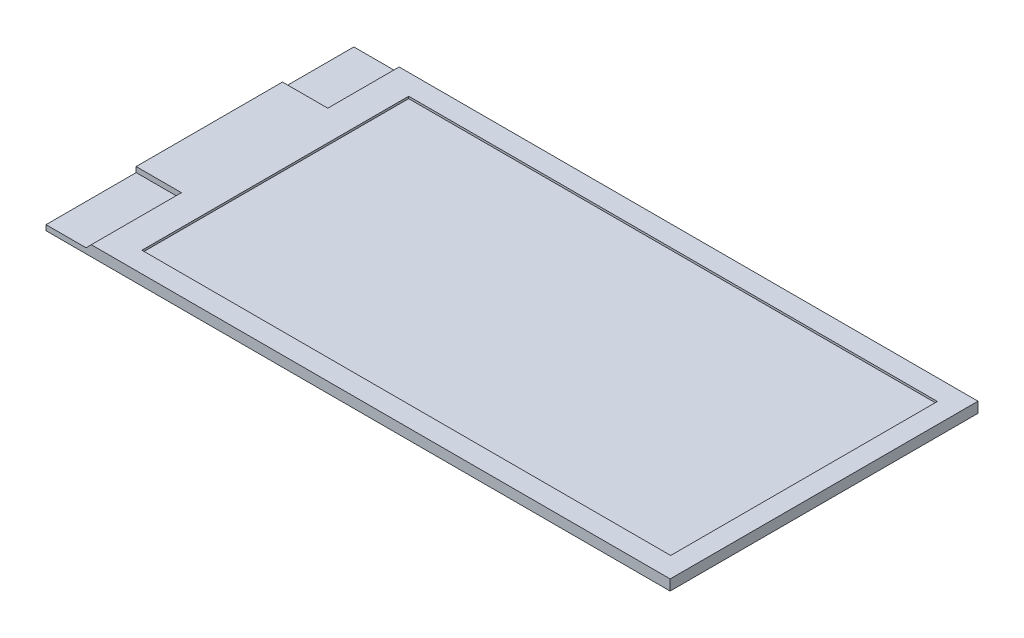
ISO-10303-21;
HEADER;
FILE_DESCRIPTION(('STEP AP214'),'2;1');
FILE_NAME('part.step','',(''),(''),'','','');
FILE_SCHEMA(('AUTOMOTIVE_DESIGN { 1 0 10303 214 1 1 1 1 }'));
ENDSEC;
DATA;
#1=APPLICATION_CONTEXT('core data for automotive mechanical design processes');
#2=APPLICATION_PROTOCOL_DEFINITION('international standard','automotive_design',2000,#1);
#3=PRODUCT_CONTEXT('',#1,'mechanical');
#4=PRODUCT('Part','Part','',(#3));
#5=PRODUCT_RELATED_PRODUCT_CATEGORY('part','',(#4));
#6=PRODUCT_DEFINITION_FORMATION('','',#4);
#7=PRODUCT_DEFINITION_CONTEXT('part definition',#1,'design');
#8=PRODUCT_DEFINITION('design','',#6,#7);
#9=PRODUCT_DEFINITION_SHAPE('','',#8);
#10=(LENGTH_UNIT() NAMED_UNIT(*) SI_UNIT(.MILLI.,.METRE.));
#11=(NAMED_UNIT(*) PLANE_ANGLE_UNIT() SI_UNIT($,.RADIAN.));
#12=(NAMED_UNIT(*) SI_UNIT($,.STERADIAN.) SOLID_ANGLE_UNIT());
#13=UNCERTAINTY_MEASURE_WITH_UNIT(LENGTH_MEASURE(1.E-05),#10,'distance_accuracy_value','');
#14=(GEOMETRIC_REPRESENTATION_CONTEXT(3) GLOBAL_UNCERTAINTY_ASSIGNED_CONTEXT((#13)) GLOBAL_UNIT_ASSIGNED_CONTEXT((#10,
#11,#12)) REPRESENTATION_CONTEXT('',''));
#15=CARTESIAN_POINT('',(0.,0.,0.));
#16=DIRECTION('',(0.,0.,1.));
#17=DIRECTION('',(1.,0.,0.));
#18=AXIS2_PLACEMENT_3D('',#15,#16,#17);
#19=CARTESIAN_POINT('',(-25.8041376103789,0.5,-14.6));
#20=DIRECTION('',(0.70710678118655,-0.707106781186545,0.));
#21=DIRECTION('',(0.707106781186545,0.70710678118655,0.));
#22=AXIS2_PLACEMENT_3D('',#19,#20,#21);
#23=PLANE('',#22);
#24=DIRECTION('',(0.,0.,1.));
#25=VECTOR('',#24,1.);
#26=CARTESIAN_POINT('',(-25.8041376103789,0.5,-14.6));
#27=LINE('',#26,#25);
#28=CARTESIAN_POINT('',(-25.8041376103789,0.5,-14.6));
#29=VERTEX_POINT('',#28);
#30=CARTESIAN_POINT('',(-25.8041376103789,0.5,-7.82999999999999));
#31=VERTEX_POINT('',#30);
#32=EDGE_CURVE('E196',#29,#31,#27,.T.);
#33=ORIENTED_EDGE('',*,*,#32,.T.);
#34=DIRECTION('',(0.707106781186545,0.70710678118655,0.));
#35=VECTOR('',#34,1.);
#36=CARTESIAN_POINT('',(-25.8041376103789,0.5,-7.82999999999999));
#37=LINE('',#36,#35);
#38=CARTESIAN_POINT('',(-25.3041376103789,1.,-7.82999999999999));
#39=VERTEX_POINT('',#38);
#40=EDGE_CURVE('E63',#31,#39,#37,.T.);
#41=ORIENTED_EDGE('',*,*,#40,.T.);
#42=DIRECTION('',(0.,0.,1.));
#43=VECTOR('',#42,1.);
#44=CARTESIAN_POINT('',(-25.3041376103789,1.,-14.6));
#45=LINE('',#44,#43);
#46=CARTESIAN_POINT('',(-25.3041376103789,1.,-14.6));
#47=VERTEX_POINT('',#46);
#48=EDGE_CURVE('E192',#47,#39,#45,.T.);
#49=ORIENTED_EDGE('',*,*,#48,.F.);
#50=DIRECTION('',(0.707106781186545,0.70710678118655,0.));
#51=VECTOR('',#50,1.);
#52=CARTESIAN_POINT('',(-25.8041376103789,0.5,-14.6));
#53=LINE('',#52,#51);
#54=EDGE_CURVE('E182',#29,#47,#53,.T.);
#55=ORIENTED_EDGE('',*,*,#54,.F.);
#56=EDGE_LOOP('',(#33,#41,#49,#55));
#57=FACE_BOUND('',#56,.T.);
#58=ADVANCED_FACE('F39',(#57),#23,.F.);
#59=CARTESIAN_POINT('',(-29.6,0.5,-14.6));
#60=DIRECTION('',(0.,-1.,0.));
#61=DIRECTION('',(0.,0.,-1.));
#62=AXIS2_PLACEMENT_3D('',#59,#60,#61);
#63=PLANE('',#62);
#64=DIRECTION('',(0.,0.,1.));
#65=VECTOR('',#64,1.);
#66=CARTESIAN_POINT('',(-29.6,0.5,-14.6));
#67=LINE('',#66,#65);
#68=CARTESIAN_POINT('',(-29.6,0.5,-14.6));
#69=VERTEX_POINT('',#68);
#70=CARTESIAN_POINT('',(-29.6,0.5,-7.82999999999999));
#71=VERTEX_POINT('',#70);
#72=EDGE_CURVE('E200',#69,#71,#67,.T.);
#73=ORIENTED_EDGE('',*,*,#72,.T.);
#74=DIRECTION('',(1.,0.,0.));
#75=VECTOR('',#74,1.);
#76=CARTESIAN_POINT('',(-29.6,0.5,-7.82999999999999));
#77=LINE('',#76,#75);
#78=EDGE_CURVE('E11',#71,#31,#77,.T.);
#79=ORIENTED_EDGE('',*,*,#78,.T.);
#80=ORIENTED_EDGE('',*,*,#32,.F.);
#81=DIRECTION('',(1.,0.,0.));
#82=VECTOR('',#81,1.);
#83=CARTESIAN_POINT('',(-29.6,0.5,-14.6));
#84=LINE('',#83,#82);
#85=EDGE_CURVE('E178',#69,#29,#84,.T.);
#86=ORIENTED_EDGE('',*,*,#85,.F.);
#87=EDGE_LOOP('',(#73,#79,#80,#86));
#88=FACE_BOUND('',#87,.T.);
#89=ADVANCED_FACE('F330',(#88),#63,.F.);
#90=CARTESIAN_POINT('',(29.6,1.,-14.6));
#91=DIRECTION('',(-1.,0.,0.));
#92=DIRECTION('',(0.,0.,1.));
#93=AXIS2_PLACEMENT_3D('',#90,#91,#92);
#94=PLANE('',#93);
#95=DIRECTION('',(0.,0.,-1.));
#96=VECTOR('',#95,1.);
#97=CARTESIAN_POINT('',(29.6,0.,-14.6));
#98=LINE('',#97,#96);
#99=CARTESIAN_POINT('',(29.6,0.,14.6));
#100=VERTEX_POINT('',#99);
#101=CARTESIAN_POINT('',(29.6,0.,-14.6));
#102=VERTEX_POINT('',#101);
#103=EDGE_CURVE('E237',#100,#102,#98,.T.);
#104=ORIENTED_EDGE('',*,*,#103,.T.);
#105=DIRECTION('',(0.,-1.,0.));
#106=VECTOR('',#105,1.);
#107=CARTESIAN_POINT('',(29.6,1.,-14.6));
#108=LINE('',#107,#106);
#109=CARTESIAN_POINT('',(29.6,1.,-14.6));
#110=VERTEX_POINT('',#109);
#111=EDGE_CURVE('E282',#110,#102,#108,.T.);
#112=ORIENTED_EDGE('',*,*,#111,.F.);
#113=DIRECTION('',(0.,0.,-1.));
#114=VECTOR('',#113,1.);
#115=CARTESIAN_POINT('',(29.6,1.,-14.6));
#116=LINE('',#115,#114);
#117=CARTESIAN_POINT('',(29.6,1.,14.6));
#118=VERTEX_POINT('',#117);
#119=EDGE_CURVE('E247',#118,#110,#116,.T.);
#120=ORIENTED_EDGE('',*,*,#119,.F.);
#121=DIRECTION('',(0.,-1.,0.));
#122=VECTOR('',#121,1.);
#123=CARTESIAN_POINT('',(29.6,1.,14.6));
#124=LINE('',#123,#122);
#125=EDGE_CURVE('E259',#118,#100,#124,.T.);
#126=ORIENTED_EDGE('',*,*,#125,.T.);
#127=EDGE_LOOP('',(#104,#112,#120,#126));
#128=FACE_BOUND('',#127,.T.);
#129=ADVANCED_FACE('F41',(#128),#94,.F.);
#130=CARTESIAN_POINT('',(-29.6,1.,-14.6));
#131=DIRECTION('',(0.,0.,1.));
#132=DIRECTION('',(1.,0.,0.));
#133=AXIS2_PLACEMENT_3D('',#130,#131,#132);
#134=PLANE('',#133);
#135=ORIENTED_EDGE('',*,*,#85,.T.);
#136=ORIENTED_EDGE('',*,*,#54,.T.);
#137=DIRECTION('',(-1.,0.,0.));
#138=VECTOR('',#137,1.);
#139=CARTESIAN_POINT('',(-29.6,1.,-14.6));
#140=LINE('',#139,#138);
#141=EDGE_CURVE('E251',#110,#47,#140,.T.);
#142=ORIENTED_EDGE('',*,*,#141,.F.);
#143=ORIENTED_EDGE('',*,*,#111,.T.);
#144=DIRECTION('',(-1.,0.,0.));
#145=VECTOR('',#144,1.);
#146=CARTESIAN_POINT('',(-29.6,0.,-14.6));
#147=LINE('',#146,#145);
#148=CARTESIAN_POINT('',(-29.6,0.,-14.6));
#149=VERTEX_POINT('',#148);
#150=EDGE_CURVE('E263',#102,#149,#147,.T.);
#151=ORIENTED_EDGE('',*,*,#150,.T.);
#152=DIRECTION('',(0.,-1.,0.));
#153=VECTOR('',#152,1.);
#154=CARTESIAN_POINT('',(-29.6,1.,-14.6));
#155=LINE('',#154,#153);
#156=EDGE_CURVE('E279',#69,#149,#155,.T.);
#157=ORIENTED_EDGE('',*,*,#156,.F.);
#158=EDGE_LOOP('',(#135,#136,#142,#143,#151,#157));
#159=FACE_BOUND('',#158,.T.);
#160=ADVANCED_FACE('F305',(#159),#134,.F.);
#161=CARTESIAN_POINT('',(-29.6,1.,-14.6));
#162=DIRECTION('',(1.,0.,0.));
#163=DIRECTION('',(0.,0.,-1.));
#164=AXIS2_PLACEMENT_3D('',#161,#162,#163);
#165=PLANE('',#164);
#166=DIRECTION('',(0.,-1.,0.));
#167=VECTOR('',#166,1.);
#168=CARTESIAN_POINT('',(-29.6,1.,-7.82999999999999));
#169=LINE('',#168,#167);
#170=CARTESIAN_POINT('',(-29.6,1.,-7.82999999999999));
#171=VERTEX_POINT('',#170);
#172=EDGE_CURVE('E161',#171,#71,#169,.T.);
#173=ORIENTED_EDGE('',*,*,#172,.T.);
#174=ORIENTED_EDGE('',*,*,#72,.F.);
#175=ORIENTED_EDGE('',*,*,#156,.T.);
#176=DIRECTION('',(0.,0.,1.));
#177=VECTOR('',#176,1.);
#178=CARTESIAN_POINT('',(-29.6,0.,-14.6));
#179=LINE('',#178,#177);
#180=CARTESIAN_POINT('',(-29.6,0.,14.6));
#181=VERTEX_POINT('',#180);
#182=EDGE_CURVE('E267',#149,#181,#179,.T.);
#183=ORIENTED_EDGE('',*,*,#182,.T.);
#184=DIRECTION('',(0.,-1.,0.));
#185=VECTOR('',#184,1.);
#186=CARTESIAN_POINT('',(-29.6,1.,14.6));
#187=LINE('',#186,#185);
#188=CARTESIAN_POINT('',(-29.6,0.5,14.6));
#189=VERTEX_POINT('',#188);
#190=EDGE_CURVE('E276',#189,#181,#187,.T.);
#191=ORIENTED_EDGE('',*,*,#190,.F.);
#192=CARTESIAN_POINT('',(-29.6,0.5,6.05000000000001));
#193=VERTEX_POINT('',#192);
#194=EDGE_CURVE('E158',#193,#189,#67,.T.);
#195=ORIENTED_EDGE('',*,*,#194,.F.);
#196=DIRECTION('',(0.,1.,0.));
#197=VECTOR('',#196,1.);
#198=CARTESIAN_POINT('',(-29.6,1.,6.05000000000001));
#199=LINE('',#198,#197);
#200=CARTESIAN_POINT('',(-29.6,1.,6.05000000000001));
#201=VERTEX_POINT('',#200);
#202=EDGE_CURVE('E145',#193,#201,#199,.T.);
#203=ORIENTED_EDGE('',*,*,#202,.T.);
#204=DIRECTION('',(0.,0.,-1.));
#205=VECTOR('',#204,1.);
#206=CARTESIAN_POINT('',(-29.6,1.,-7.82999999999999));
#207=LINE('',#206,#205);
#208=EDGE_CURVE('E151',#201,#171,#207,.T.);
#209=ORIENTED_EDGE('',*,*,#208,.T.);
#210=EDGE_LOOP('',(#173,#174,#175,#183,#191,#195,#203,#209));
#211=FACE_BOUND('',#210,.T.);
#212=ADVANCED_FACE('F156',(#211),#165,.F.);
#213=CARTESIAN_POINT('',(-29.6,1.,14.6));
#214=DIRECTION('',(0.,0.,-1.));
#215=DIRECTION('',(-1.,0.,0.));
#216=AXIS2_PLACEMENT_3D('',#213,#214,#215);
#217=PLANE('',#216);
#218=DIRECTION('',(1.,0.,0.));
#219=VECTOR('',#218,1.);
#220=CARTESIAN_POINT('',(-29.6,1.,14.6));
#221=LINE('',#220,#219);
#222=CARTESIAN_POINT('',(-25.3041376103789,1.,14.6));
#223=VERTEX_POINT('',#222);
#224=EDGE_CURVE('E256',#223,#118,#221,.T.);
#225=ORIENTED_EDGE('',*,*,#224,.F.);
#226=DIRECTION('',(0.707106781186545,0.70710678118655,0.));
#227=VECTOR('',#226,1.);
#228=CARTESIAN_POINT('',(-25.8041376103789,0.5,14.6));
#229=LINE('',#228,#227);
#230=CARTESIAN_POINT('',(-25.8041376103789,0.5,14.6));
#231=VERTEX_POINT('',#230);
#232=EDGE_CURVE('E183',#231,#223,#229,.T.);
#233=ORIENTED_EDGE('',*,*,#232,.F.);
#234=DIRECTION('',(1.,0.,0.));
#235=VECTOR('',#234,1.);
#236=CARTESIAN_POINT('',(-29.6,0.5,14.6));
#237=LINE('',#236,#235);
#238=EDGE_CURVE('E177',#189,#231,#237,.T.);
#239=ORIENTED_EDGE('',*,*,#238,.F.);
#240=ORIENTED_EDGE('',*,*,#190,.T.);
#241=DIRECTION('',(1.,0.,0.));
#242=VECTOR('',#241,1.);
#243=CARTESIAN_POINT('',(-29.6,0.,14.6));
#244=LINE('',#243,#242);
#245=EDGE_CURVE('E252',#181,#100,#244,.T.);
#246=ORIENTED_EDGE('',*,*,#245,.T.);
#247=ORIENTED_EDGE('',*,*,#125,.F.);
#248=EDGE_LOOP('',(#225,#233,#239,#240,#246,#247));
#249=FACE_BOUND('',#248,.T.);
#250=ADVANCED_FACE('F298',(#249),#217,.F.);
#251=CARTESIAN_POINT('',(0.,1.,0.));
#252=DIRECTION('',(0.,1.,0.));
#253=DIRECTION('',(0.,0.,1.));
#254=AXIS2_PLACEMENT_3D('',#251,#252,#253);
#255=PLANE('',#254);
#256=ORIENTED_EDGE('',*,*,#48,.T.);
#257=DIRECTION('',(-1.,0.,0.));
#258=VECTOR('',#257,1.);
#259=CARTESIAN_POINT('',(-25.1,1.,-7.82999999999999));
#260=LINE('',#259,#258);
#261=EDGE_CURVE('E150',#39,#171,#260,.T.);
#262=ORIENTED_EDGE('',*,*,#261,.T.);
#263=ORIENTED_EDGE('',*,*,#208,.F.);
#264=DIRECTION('',(-1.,0.,0.));
#265=VECTOR('',#264,1.);
#266=CARTESIAN_POINT('',(-25.1,1.,6.05));
#267=LINE('',#266,#265);
#268=CARTESIAN_POINT('',(-25.3041376103789,1.,6.05));
#269=VERTEX_POINT('',#268);
#270=EDGE_CURVE('E141',#269,#201,#267,.T.);
#271=ORIENTED_EDGE('',*,*,#270,.F.);
#272=EDGE_CURVE('E55',#269,#223,#45,.T.);
#273=ORIENTED_EDGE('',*,*,#272,.T.);
#274=ORIENTED_EDGE('',*,*,#224,.T.);
#275=ORIENTED_EDGE('',*,*,#119,.T.);
#276=ORIENTED_EDGE('',*,*,#141,.T.);
#277=EDGE_LOOP('',(#256,#262,#263,#271,#273,#274,#275,#276));
#278=FACE_BOUND('',#277,.T.);
#279=DIRECTION('',(0.,0.,-1.));
#280=VECTOR('',#279,1.);
#281=CARTESIAN_POINT('',(27.7,1.,-12.65));
#282=LINE('',#281,#280);
#283=CARTESIAN_POINT('',(27.7,1.,12.65));
#284=VERTEX_POINT('',#283);
#285=CARTESIAN_POINT('',(27.7,1.,-12.65));
#286=VERTEX_POINT('',#285);
#287=EDGE_CURVE('E195',#284,#286,#282,.T.);
#288=ORIENTED_EDGE('',*,*,#287,.F.);
#289=DIRECTION('',(1.,0.,0.));
#290=VECTOR('',#289,1.);
#291=CARTESIAN_POINT('',(-22.45,1.,12.65));
#292=LINE('',#291,#290);
#293=CARTESIAN_POINT('',(-22.45,1.,12.65));
#294=VERTEX_POINT('',#293);
#295=EDGE_CURVE('E208',#294,#284,#292,.T.);
#296=ORIENTED_EDGE('',*,*,#295,.F.);
#297=DIRECTION('',(0.,0.,1.));
#298=VECTOR('',#297,1.);
#299=CARTESIAN_POINT('',(-22.45,1.,-12.65));
#300=LINE('',#299,#298);
#301=CARTESIAN_POINT('',(-22.45,1.,-12.65));
#302=VERTEX_POINT('',#301);
#303=EDGE_CURVE('E227',#302,#294,#300,.T.);
#304=ORIENTED_EDGE('',*,*,#303,.F.);
#305=DIRECTION('',(-1.,0.,0.));
#306=VECTOR('',#305,1.);
#307=CARTESIAN_POINT('',(-22.45,1.,-12.65));
#308=LINE('',#307,#306);
#309=EDGE_CURVE('E223',#286,#302,#308,.T.);
#310=ORIENTED_EDGE('',*,*,#309,.F.);
#311=EDGE_LOOP('',(#288,#296,#304,#310));
#312=FACE_BOUND('',#311,.T.);
#313=ADVANCED_FACE('F163',(#278,#312),#255,.T.);
#314=CARTESIAN_POINT('',(0.,0.,0.));
#315=DIRECTION('',(0.,1.,0.));
#316=DIRECTION('',(0.,0.,1.));
#317=AXIS2_PLACEMENT_3D('',#314,#315,#316);
#318=PLANE('',#317);
#319=ORIENTED_EDGE('',*,*,#103,.F.);
#320=ORIENTED_EDGE('',*,*,#245,.F.);
#321=ORIENTED_EDGE('',*,*,#182,.F.);
#322=ORIENTED_EDGE('',*,*,#150,.F.);
#323=EDGE_LOOP('',(#319,#320,#321,#322));
#324=FACE_BOUND('',#323,.T.);
#325=ADVANCED_FACE('F316',(#324),#318,.F.);
#326=CARTESIAN_POINT('',(27.7,0.8,-12.65));
#327=DIRECTION('',(1.,0.,0.));
#328=DIRECTION('',(0.,0.,-1.));
#329=AXIS2_PLACEMENT_3D('',#326,#327,#328);
#330=PLANE('',#329);
#331=ORIENTED_EDGE('',*,*,#287,.T.);
#332=DIRECTION('',(0.,1.,0.));
#333=VECTOR('',#332,1.);
#334=CARTESIAN_POINT('',(27.7,0.8,-12.65));
#335=LINE('',#334,#333);
#336=CARTESIAN_POINT('',(27.7,0.8,-12.65));
#337=VERTEX_POINT('',#336);
#338=EDGE_CURVE('E220',#337,#286,#335,.T.);
#339=ORIENTED_EDGE('',*,*,#338,.F.);
#340=DIRECTION('',(0.,0.,-1.));
#341=VECTOR('',#340,1.);
#342=CARTESIAN_POINT('',(27.7,0.8,-12.65));
#343=LINE('',#342,#341);
#344=CARTESIAN_POINT('',(27.7,0.8,12.65));
#345=VERTEX_POINT('',#344);
#346=EDGE_CURVE('E203',#345,#337,#343,.T.);
#347=ORIENTED_EDGE('',*,*,#346,.F.);
#348=DIRECTION('',(0.,1.,0.));
#349=VECTOR('',#348,1.);
#350=CARTESIAN_POINT('',(27.7,0.8,12.65));
#351=LINE('',#350,#349);
#352=EDGE_CURVE('E234',#345,#284,#351,.T.);
#353=ORIENTED_EDGE('',*,*,#352,.T.);
#354=EDGE_LOOP('',(#331,#339,#347,#353));
#355=FACE_BOUND('',#354,.T.);
#356=ADVANCED_FACE('F318',(#355),#330,.F.);
#357=CARTESIAN_POINT('',(-22.45,0.8,12.65));
#358=DIRECTION('',(0.,0.,1.));
#359=DIRECTION('',(1.,0.,0.));
#360=AXIS2_PLACEMENT_3D('',#357,#358,#359);
#361=PLANE('',#360);
#362=ORIENTED_EDGE('',*,*,#295,.T.);
#363=ORIENTED_EDGE('',*,*,#352,.F.);
#364=DIRECTION('',(1.,0.,0.));
#365=VECTOR('',#364,1.);
#366=CARTESIAN_POINT('',(-22.45,0.8,12.65));
#367=LINE('',#366,#365);
#368=CARTESIAN_POINT('',(-22.45,0.8,12.65));
#369=VERTEX_POINT('',#368);
#370=EDGE_CURVE('E216',#369,#345,#367,.T.);
#371=ORIENTED_EDGE('',*,*,#370,.F.);
#372=DIRECTION('',(0.,1.,0.));
#373=VECTOR('',#372,1.);
#374=CARTESIAN_POINT('',(-22.45,0.8,12.65));
#375=LINE('',#374,#373);
#376=EDGE_CURVE('E238',#369,#294,#375,.T.);
#377=ORIENTED_EDGE('',*,*,#376,.T.);
#378=EDGE_LOOP('',(#362,#363,#371,#377));
#379=FACE_BOUND('',#378,.T.);
#380=ADVANCED_FACE('F324',(#379),#361,.F.);
#381=CARTESIAN_POINT('',(-22.45,0.8,-12.65));
#382=DIRECTION('',(-1.,0.,0.));
#383=DIRECTION('',(0.,0.,1.));
#384=AXIS2_PLACEMENT_3D('',#381,#382,#383);
#385=PLANE('',#384);
#386=ORIENTED_EDGE('',*,*,#303,.T.);
#387=ORIENTED_EDGE('',*,*,#376,.F.);
#388=DIRECTION('',(0.,0.,1.));
#389=VECTOR('',#388,1.);
#390=CARTESIAN_POINT('',(-22.45,0.8,-12.65));
#391=LINE('',#390,#389);
#392=CARTESIAN_POINT('',(-22.45,0.8,-12.65));
#393=VERTEX_POINT('',#392);
#394=EDGE_CURVE('E212',#393,#369,#391,.T.);
#395=ORIENTED_EDGE('',*,*,#394,.F.);
#396=DIRECTION('',(0.,1.,0.));
#397=VECTOR('',#396,1.);
#398=CARTESIAN_POINT('',(-22.45,0.8,-12.65));
#399=LINE('',#398,#397);
#400=EDGE_CURVE('E241',#393,#302,#399,.T.);
#401=ORIENTED_EDGE('',*,*,#400,.T.);
#402=EDGE_LOOP('',(#386,#387,#395,#401));
#403=FACE_BOUND('',#402,.T.);
#404=ADVANCED_FACE('F349',(#403),#385,.F.);
#405=CARTESIAN_POINT('',(-22.45,0.8,-12.65));
#406=DIRECTION('',(0.,0.,-1.));
#407=DIRECTION('',(-1.,0.,0.));
#408=AXIS2_PLACEMENT_3D('',#405,#406,#407);
#409=PLANE('',#408);
#410=ORIENTED_EDGE('',*,*,#309,.T.);
#411=ORIENTED_EDGE('',*,*,#400,.F.);
#412=DIRECTION('',(-1.,0.,0.));
#413=VECTOR('',#412,1.);
#414=CARTESIAN_POINT('',(-22.45,0.8,-12.65));
#415=LINE('',#414,#413);
#416=EDGE_CURVE('E207',#337,#393,#415,.T.);
#417=ORIENTED_EDGE('',*,*,#416,.F.);
#418=ORIENTED_EDGE('',*,*,#338,.T.);
#419=EDGE_LOOP('',(#410,#411,#417,#418));
#420=FACE_BOUND('',#419,.T.);
#421=ADVANCED_FACE('F343',(#420),#409,.F.);
#422=CARTESIAN_POINT('',(0.,0.8,0.));
#423=DIRECTION('',(0.,1.,0.));
#424=DIRECTION('',(0.,0.,1.));
#425=AXIS2_PLACEMENT_3D('',#422,#423,#424);
#426=PLANE('',#425);
#427=ORIENTED_EDGE('',*,*,#346,.T.);
#428=ORIENTED_EDGE('',*,*,#416,.T.);
#429=ORIENTED_EDGE('',*,*,#394,.T.);
#430=ORIENTED_EDGE('',*,*,#370,.T.);
#431=EDGE_LOOP('',(#427,#428,#429,#430));
#432=FACE_BOUND('',#431,.T.);
#433=ADVANCED_FACE('F338',(#432),#426,.T.);
#434=ORIENTED_EDGE('',*,*,#272,.F.);
#435=DIRECTION('',(-0.707106781186545,-0.70710678118655,0.));
#436=VECTOR('',#435,1.);
#437=CARTESIAN_POINT('',(-25.8041376103789,0.500000000000001,6.05));
#438=LINE('',#437,#436);
#439=CARTESIAN_POINT('',(-25.8041376103789,0.5,6.05));
#440=VERTEX_POINT('',#439);
#441=EDGE_CURVE('E146',#269,#440,#438,.T.);
#442=ORIENTED_EDGE('',*,*,#441,.T.);
#443=EDGE_CURVE('E199',#440,#231,#27,.T.);
#444=ORIENTED_EDGE('',*,*,#443,.T.);
#445=ORIENTED_EDGE('',*,*,#232,.T.);
#446=EDGE_LOOP('',(#434,#442,#444,#445));
#447=FACE_BOUND('',#446,.T.);
#448=ADVANCED_FACE('F296',(#447),#23,.F.);
#449=ORIENTED_EDGE('',*,*,#443,.F.);
#450=DIRECTION('',(-1.,0.,0.));
#451=VECTOR('',#450,1.);
#452=CARTESIAN_POINT('',(-29.6,0.5,6.05));
#453=LINE('',#452,#451);
#454=EDGE_CURVE('E48',#440,#193,#453,.T.);
#455=ORIENTED_EDGE('',*,*,#454,.T.);
#456=ORIENTED_EDGE('',*,*,#194,.T.);
#457=ORIENTED_EDGE('',*,*,#238,.T.);
#458=EDGE_LOOP('',(#449,#455,#456,#457));
#459=FACE_BOUND('',#458,.T.);
#460=ADVANCED_FACE('F288',(#459),#63,.F.);
#461=CARTESIAN_POINT('',(-25.1,1.,-7.82999999999999));
#462=DIRECTION('',(0.,0.,-1.));
#463=DIRECTION('',(-1.,0.,0.));
#464=AXIS2_PLACEMENT_3D('',#461,#462,#463);
#465=PLANE('',#464);
#466=ORIENTED_EDGE('',*,*,#40,.F.);
#467=ORIENTED_EDGE('',*,*,#78,.F.);
#468=ORIENTED_EDGE('',*,*,#172,.F.);
#469=ORIENTED_EDGE('',*,*,#261,.F.);
#470=EDGE_LOOP('',(#466,#467,#468,#469));
#471=FACE_BOUND('',#470,.T.);
#472=ADVANCED_FACE('F311',(#471),#465,.T.);
#473=CARTESIAN_POINT('',(-25.1,1.,6.05));
#474=DIRECTION('',(0.,0.,1.));
#475=DIRECTION('',(1.,0.,0.));
#476=AXIS2_PLACEMENT_3D('',#473,#474,#475);
#477=PLANE('',#476);
#478=ORIENTED_EDGE('',*,*,#441,.F.);
#479=ORIENTED_EDGE('',*,*,#270,.T.);
#480=ORIENTED_EDGE('',*,*,#202,.F.);
#481=ORIENTED_EDGE('',*,*,#454,.F.);
#482=EDGE_LOOP('',(#478,#479,#480,#481));
#483=FACE_BOUND('',#482,.T.);
#484=ADVANCED_FACE('F143',(#483),#477,.T.);
#485=CLOSED_SHELL('',(#58,#89,#129,#160,#212,#250,#313,#325,#356,#380,#404,#421,#433,#448,#460,
#472,#484));
#486=MANIFOLD_SOLID_BREP('B2',#485);
#487=ADVANCED_BREP_SHAPE_REPRESENTATION('',(#18,#486),#14);
#488=SHAPE_DEFINITION_REPRESENTATION(#9,#487);
ENDSEC;
END-ISO-10303-21;
